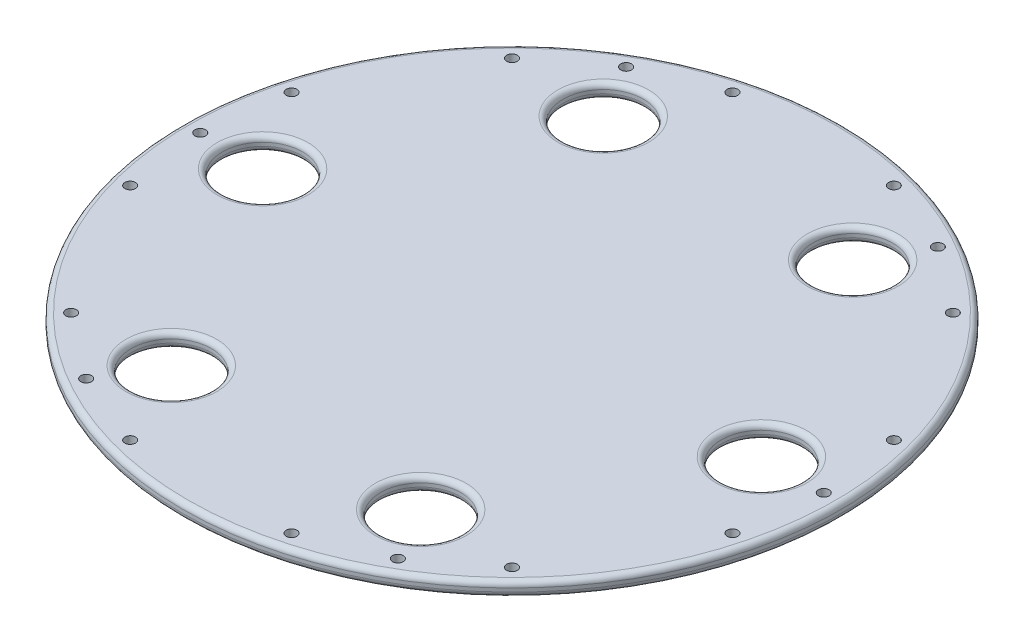
ISO-10303-21;
HEADER;
FILE_DESCRIPTION(('STEP AP214'),'2;1');
FILE_NAME('part.step','',(''),(''),'','','');
FILE_SCHEMA(('AUTOMOTIVE_DESIGN { 1 0 10303 214 1 1 1 1 }'));
ENDSEC;
DATA;
#1=APPLICATION_CONTEXT('core data for automotive mechanical design processes');
#2=APPLICATION_PROTOCOL_DEFINITION('international standard','automotive_design',2000,#1);
#3=PRODUCT_CONTEXT('',#1,'mechanical');
#4=PRODUCT('Part','Part','',(#3));
#5=PRODUCT_RELATED_PRODUCT_CATEGORY('part','',(#4));
#6=PRODUCT_DEFINITION_FORMATION('','',#4);
#7=PRODUCT_DEFINITION_CONTEXT('part definition',#1,'design');
#8=PRODUCT_DEFINITION('design','',#6,#7);
#9=PRODUCT_DEFINITION_SHAPE('','',#8);
#10=(LENGTH_UNIT() NAMED_UNIT(*) SI_UNIT(.MILLI.,.METRE.));
#11=(NAMED_UNIT(*) PLANE_ANGLE_UNIT() SI_UNIT($,.RADIAN.));
#12=(NAMED_UNIT(*) SI_UNIT($,.STERADIAN.) SOLID_ANGLE_UNIT());
#13=UNCERTAINTY_MEASURE_WITH_UNIT(LENGTH_MEASURE(1.E-05),#10,'distance_accuracy_value','');
#14=(GEOMETRIC_REPRESENTATION_CONTEXT(3) GLOBAL_UNCERTAINTY_ASSIGNED_CONTEXT((#13)) GLOBAL_UNIT_ASSIGNED_CONTEXT((#10,
#11,#12)) REPRESENTATION_CONTEXT('',''));
#15=CARTESIAN_POINT('',(0.,0.,0.));
#16=DIRECTION('',(0.,0.,1.));
#17=DIRECTION('',(1.,0.,0.));
#18=AXIS2_PLACEMENT_3D('',#15,#16,#17);
#19=CARTESIAN_POINT('',(0.,4.,0.));
#20=DIRECTION('',(0.,-1.,0.));
#21=DIRECTION('',(0.,0.,-1.));
#22=AXIS2_PLACEMENT_3D('',#19,#20,#21);
#23=CYLINDRICAL_SURFACE('',#22,92.5);
#24=CARTESIAN_POINT('',(0.,2.5,0.));
#25=DIRECTION('',(0.,1.,0.));
#26=DIRECTION('',(0.,0.,1.));
#27=AXIS2_PLACEMENT_3D('',#24,#25,#26);
#28=CIRCLE('',#27,92.5);
#29=CARTESIAN_POINT('',(0.,2.5,92.5));
#30=VERTEX_POINT('',#29);
#31=EDGE_CURVE('E10',#30,#30,#28,.F.);
#32=ORIENTED_EDGE('',*,*,#31,.T.);
#33=EDGE_LOOP('',(#32));
#34=FACE_BOUND('',#33,.T.);
#35=CARTESIAN_POINT('',(0.,1.5,0.));
#36=DIRECTION('',(0.,1.,0.));
#37=DIRECTION('',(0.,0.,1.));
#38=AXIS2_PLACEMENT_3D('',#35,#36,#37);
#39=CIRCLE('',#38,92.5);
#40=CARTESIAN_POINT('',(0.,1.5,92.5));
#41=VERTEX_POINT('',#40);
#42=EDGE_CURVE('E51',#41,#41,#39,.T.);
#43=ORIENTED_EDGE('',*,*,#42,.T.);
#44=EDGE_LOOP('',(#43));
#45=FACE_BOUND('',#44,.T.);
#46=ADVANCED_FACE('F43',(#34,#45),#23,.T.);
#47=CARTESIAN_POINT('',(0.,4.,0.));
#48=DIRECTION('',(0.,1.,0.));
#49=DIRECTION('',(0.,0.,1.));
#50=AXIS2_PLACEMENT_3D('',#47,#48,#49);
#51=PLANE('',#50);
#52=CARTESIAN_POINT('',(35.0000000000007,4.,-60.6217782649103));
#53=DIRECTION('',(0.,1.,0.));
#54=DIRECTION('',(0.,0.,1.));
#55=AXIS2_PLACEMENT_3D('',#52,#53,#54);
#56=CIRCLE('',#55,12.75);
#57=CARTESIAN_POINT('',(35.0000000000007,4.,-47.8717782649103));
#58=VERTEX_POINT('',#57);
#59=EDGE_CURVE('E127',#58,#58,#56,.F.);
#60=ORIENTED_EDGE('',*,*,#59,.T.);
#61=EDGE_LOOP('',(#60));
#62=FACE_BOUND('',#61,.T.);
#63=CARTESIAN_POINT('',(-35.0000000000003,4.,-60.6217782649105));
#64=DIRECTION('',(0.,1.,0.));
#65=DIRECTION('',(0.,0.,1.));
#66=AXIS2_PLACEMENT_3D('',#63,#64,#65);
#67=CIRCLE('',#66,12.75);
#68=CARTESIAN_POINT('',(-35.0000000000003,4.,-47.8717782649105));
#69=VERTEX_POINT('',#68);
#70=EDGE_CURVE('E131',#69,#69,#67,.F.);
#71=ORIENTED_EDGE('',*,*,#70,.T.);
#72=EDGE_LOOP('',(#71));
#73=FACE_BOUND('',#72,.T.);
#74=CARTESIAN_POINT('',(70.,4.,0.));
#75=DIRECTION('',(0.,1.,0.));
#76=DIRECTION('',(0.,0.,1.));
#77=AXIS2_PLACEMENT_3D('',#74,#75,#76);
#78=CIRCLE('',#77,12.75);
#79=CARTESIAN_POINT('',(70.,4.,12.75));
#80=VERTEX_POINT('',#79);
#81=EDGE_CURVE('E135',#80,#80,#78,.F.);
#82=ORIENTED_EDGE('',*,*,#81,.T.);
#83=EDGE_LOOP('',(#82));
#84=FACE_BOUND('',#83,.T.);
#85=CARTESIAN_POINT('',(34.9999999999999,4.,60.6217782649108));
#86=DIRECTION('',(0.,1.,0.));
#87=DIRECTION('',(0.,0.,1.));
#88=AXIS2_PLACEMENT_3D('',#85,#86,#87);
#89=CIRCLE('',#88,12.75);
#90=CARTESIAN_POINT('',(34.9999999999999,4.,73.3717782649108));
#91=VERTEX_POINT('',#90);
#92=EDGE_CURVE('E139',#91,#91,#89,.F.);
#93=ORIENTED_EDGE('',*,*,#92,.T.);
#94=EDGE_LOOP('',(#93));
#95=FACE_BOUND('',#94,.T.);
#96=CARTESIAN_POINT('',(-35.0000000000003,4.,60.6217782649106));
#97=DIRECTION('',(0.,1.,0.));
#98=DIRECTION('',(0.,0.,1.));
#99=AXIS2_PLACEMENT_3D('',#96,#97,#98);
#100=CIRCLE('',#99,12.75);
#101=CARTESIAN_POINT('',(-35.0000000000003,4.,73.3717782649106));
#102=VERTEX_POINT('',#101);
#103=EDGE_CURVE('E143',#102,#102,#100,.F.);
#104=ORIENTED_EDGE('',*,*,#103,.T.);
#105=EDGE_LOOP('',(#104));
#106=FACE_BOUND('',#105,.T.);
#107=CARTESIAN_POINT('',(-70.,4.,-4.47558656802016E-13));
#108=DIRECTION('',(0.,1.,0.));
#109=DIRECTION('',(0.,0.,1.));
#110=AXIS2_PLACEMENT_3D('',#107,#108,#109);
#111=CIRCLE('',#110,12.75);
#112=CARTESIAN_POINT('',(-70.,4.,12.7499999999996));
#113=VERTEX_POINT('',#112);
#114=EDGE_CURVE('E147',#113,#113,#111,.F.);
#115=ORIENTED_EDGE('',*,*,#114,.T.);
#116=EDGE_LOOP('',(#115));
#117=FACE_BOUND('',#116,.T.);
#118=CARTESIAN_POINT('',(0.,4.,0.));
#119=DIRECTION('',(0.,1.,0.));
#120=DIRECTION('',(0.,0.,1.));
#121=AXIS2_PLACEMENT_3D('',#118,#119,#120);
#122=CIRCLE('',#121,91.);
#123=CARTESIAN_POINT('',(0.,4.,91.));
#124=VERTEX_POINT('',#123);
#125=EDGE_CURVE('E151',#124,#124,#122,.T.);
#126=ORIENTED_EDGE('',*,*,#125,.T.);
#127=EDGE_LOOP('',(#126));
#128=FACE_BOUND('',#127,.T.);
#129=CARTESIAN_POINT('',(-43.7499999999932,4.,75.7772228311387));
#130=DIRECTION('',(0.,1.,0.));
#131=DIRECTION('',(0.,0.,1.));
#132=AXIS2_PLACEMENT_3D('',#129,#130,#131);
#133=CIRCLE('',#132,1.50000000000557);
#134=CARTESIAN_POINT('',(-43.7499999999932,4.,77.2772228311443));
#135=VERTEX_POINT('',#134);
#136=EDGE_CURVE('E216',#135,#135,#133,.T.);
#137=ORIENTED_EDGE('',*,*,#136,.F.);
#138=EDGE_LOOP('',(#137));
#139=FACE_BOUND('',#138,.T.);
#140=CARTESIAN_POINT('',(-22.6466664464653,4.,84.5185098002893));
#141=DIRECTION('',(0.,1.,0.));
#142=DIRECTION('',(0.,0.,1.));
#143=AXIS2_PLACEMENT_3D('',#140,#141,#142);
#144=CIRCLE('',#143,1.50000000000306);
#145=CARTESIAN_POINT('',(-22.6466664464653,4.,86.0185098002924));
#146=VERTEX_POINT('',#145);
#147=EDGE_CURVE('E225',#146,#146,#144,.T.);
#148=ORIENTED_EDGE('',*,*,#147,.F.);
#149=EDGE_LOOP('',(#148));
#150=FACE_BOUND('',#149,.T.);
#151=CARTESIAN_POINT('',(22.6466664464725,4.,84.5185098002885));
#152=DIRECTION('',(0.,1.,0.));
#153=DIRECTION('',(0.,0.,1.));
#154=AXIS2_PLACEMENT_3D('',#151,#152,#153);
#155=CIRCLE('',#154,1.50000000000234);
#156=CARTESIAN_POINT('',(22.6466664464725,4.,86.0185098002908));
#157=VERTEX_POINT('',#156);
#158=EDGE_CURVE('E233',#157,#157,#155,.T.);
#159=ORIENTED_EDGE('',*,*,#158,.F.);
#160=EDGE_LOOP('',(#159));
#161=FACE_BOUND('',#160,.T.);
#162=CARTESIAN_POINT('',(43.7500000000069,4.,75.7772228311346));
#163=DIRECTION('',(0.,1.,0.));
#164=DIRECTION('',(0.,0.,1.));
#165=AXIS2_PLACEMENT_3D('',#162,#163,#164);
#166=CIRCLE('',#165,1.50000000000785);
#167=CARTESIAN_POINT('',(43.7500000000069,4.,77.2772228311424));
#168=VERTEX_POINT('',#167);
#169=EDGE_CURVE('E241',#168,#168,#166,.T.);
#170=ORIENTED_EDGE('',*,*,#169,.F.);
#171=EDGE_LOOP('',(#170));
#172=FACE_BOUND('',#171,.T.);
#173=CARTESIAN_POINT('',(61.8718433538251,4.,61.8718433538181));
#174=DIRECTION('',(0.,1.,0.));
#175=DIRECTION('',(0.,0.,1.));
#176=AXIS2_PLACEMENT_3D('',#173,#174,#175);
#177=CIRCLE('',#176,1.50000000000453);
#178=CARTESIAN_POINT('',(61.8718433538251,4.,63.3718433538227));
#179=VERTEX_POINT('',#178);
#180=EDGE_CURVE('E249',#179,#179,#177,.T.);
#181=ORIENTED_EDGE('',*,*,#180,.F.);
#182=EDGE_LOOP('',(#181));
#183=FACE_BOUND('',#182,.T.);
#184=CARTESIAN_POINT('',(61.871843353824,4.,-61.871843353822));
#185=DIRECTION('',(0.,1.,0.));
#186=DIRECTION('',(0.,0.,1.));
#187=AXIS2_PLACEMENT_3D('',#184,#185,#186);
#188=CIRCLE('',#187,1.50000000000005);
#189=CARTESIAN_POINT('',(61.871843353824,4.,-60.371843353822));
#190=VERTEX_POINT('',#189);
#191=EDGE_CURVE('E257',#190,#190,#188,.T.);
#192=ORIENTED_EDGE('',*,*,#191,.F.);
#193=EDGE_LOOP('',(#192));
#194=FACE_BOUND('',#193,.T.);
#195=CARTESIAN_POINT('',(43.7499999999997,4.,-75.7772228311423));
#196=DIRECTION('',(0.,1.,0.));
#197=DIRECTION('',(0.,0.,1.));
#198=AXIS2_PLACEMENT_3D('',#195,#196,#197);
#199=CIRCLE('',#198,1.50000000000427);
#200=CARTESIAN_POINT('',(43.7499999999997,4.,-74.2772228311381));
#201=VERTEX_POINT('',#200);
#202=EDGE_CURVE('E265',#201,#201,#199,.T.);
#203=ORIENTED_EDGE('',*,*,#202,.F.);
#204=EDGE_LOOP('',(#203));
#205=FACE_BOUND('',#204,.T.);
#206=CARTESIAN_POINT('',(22.6466664464717,4.,-84.5185098002929));
#207=DIRECTION('',(0.,1.,0.));
#208=DIRECTION('',(0.,0.,1.));
#209=AXIS2_PLACEMENT_3D('',#206,#207,#208);
#210=CIRCLE('',#209,1.49999999999999);
#211=CARTESIAN_POINT('',(22.6466664464717,4.,-83.018509800293));
#212=VERTEX_POINT('',#211);
#213=EDGE_CURVE('E208',#212,#212,#210,.T.);
#214=ORIENTED_EDGE('',*,*,#213,.F.);
#215=EDGE_LOOP('',(#214));
#216=FACE_BOUND('',#215,.T.);
#217=CARTESIAN_POINT('',(87.5000000000033,4.,-5.9871259849574E-12));
#218=DIRECTION('',(0.,1.,0.));
#219=DIRECTION('',(0.,0.,1.));
#220=AXIS2_PLACEMENT_3D('',#217,#218,#219);
#221=CIRCLE('',#220,1.50000000000731);
#222=CARTESIAN_POINT('',(87.5000000000033,4.,1.50000000000132));
#223=VERTEX_POINT('',#222);
#224=EDGE_CURVE('E168',#223,#223,#221,.T.);
#225=ORIENTED_EDGE('',*,*,#224,.F.);
#226=EDGE_LOOP('',(#225));
#227=FACE_BOUND('',#226,.T.);
#228=CARTESIAN_POINT('',(84.5185098002933,4.,22.6466664464682));
#229=DIRECTION('',(0.,1.,0.));
#230=DIRECTION('',(0.,0.,1.));
#231=AXIS2_PLACEMENT_3D('',#228,#229,#230);
#232=CIRCLE('',#231,1.50000000000274);
#233=CARTESIAN_POINT('',(84.5185098002933,4.,24.146666446471));
#234=VERTEX_POINT('',#233);
#235=EDGE_CURVE('E193',#234,#234,#232,.T.);
#236=ORIENTED_EDGE('',*,*,#235,.F.);
#237=EDGE_LOOP('',(#236));
#238=FACE_BOUND('',#237,.T.);
#239=CARTESIAN_POINT('',(-61.8718433538187,4.,-61.8718433538218));
#240=DIRECTION('',(0.,1.,0.));
#241=DIRECTION('',(0.,0.,1.));
#242=AXIS2_PLACEMENT_3D('',#239,#240,#241);
#243=CIRCLE('',#242,1.49999999999655);
#244=CARTESIAN_POINT('',(-61.8718433538187,4.,-60.3718433538252));
#245=VERTEX_POINT('',#244);
#246=EDGE_CURVE('E185',#245,#245,#243,.T.);
#247=ORIENTED_EDGE('',*,*,#246,.F.);
#248=EDGE_LOOP('',(#247));
#249=FACE_BOUND('',#248,.T.);
#250=CARTESIAN_POINT('',(-43.7500000000004,4.,-75.7772228311382));
#251=DIRECTION('',(0.,1.,0.));
#252=DIRECTION('',(0.,0.,1.));
#253=AXIS2_PLACEMENT_3D('',#250,#251,#252);
#254=CIRCLE('',#253,1.50000000000004);
#255=CARTESIAN_POINT('',(-43.7500000000004,4.,-74.2772228311382));
#256=VERTEX_POINT('',#255);
#257=EDGE_CURVE('E176',#256,#256,#254,.T.);
#258=ORIENTED_EDGE('',*,*,#257,.F.);
#259=EDGE_LOOP('',(#258));
#260=FACE_BOUND('',#259,.T.);
#261=CARTESIAN_POINT('',(-22.6466664464661,4.,-84.5185098002921));
#262=DIRECTION('',(0.,1.,0.));
#263=DIRECTION('',(0.,0.,1.));
#264=AXIS2_PLACEMENT_3D('',#261,#262,#263);
#265=CIRCLE('',#264,1.49999999999518);
#266=CARTESIAN_POINT('',(-22.6466664464661,4.,-83.0185098002969));
#267=VERTEX_POINT('',#266);
#268=EDGE_CURVE('E177',#267,#267,#265,.T.);
#269=ORIENTED_EDGE('',*,*,#268,.F.);
#270=EDGE_LOOP('',(#269));
#271=FACE_BOUND('',#270,.T.);
#272=CARTESIAN_POINT('',(-84.5185098002868,4.,-22.6466664464719));
#273=DIRECTION('',(0.,1.,0.));
#274=DIRECTION('',(0.,0.,1.));
#275=AXIS2_PLACEMENT_3D('',#272,#273,#274);
#276=CIRCLE('',#275,1.49999999999633);
#277=CARTESIAN_POINT('',(-84.5185098002868,4.,-21.1466664464756));
#278=VERTEX_POINT('',#277);
#279=EDGE_CURVE('E280',#278,#278,#276,.T.);
#280=ORIENTED_EDGE('',*,*,#279,.F.);
#281=EDGE_LOOP('',(#280));
#282=FACE_BOUND('',#281,.T.);
#283=CARTESIAN_POINT('',(-87.4999999999969,4.,2.3177192614952E-12));
#284=DIRECTION('',(0.,1.,0.));
#285=DIRECTION('',(0.,0.,1.));
#286=AXIS2_PLACEMENT_3D('',#283,#284,#285);
#287=CIRCLE('',#286,1.50000000000212);
#288=CARTESIAN_POINT('',(-87.4999999999969,4.,1.50000000000444));
#289=VERTEX_POINT('',#288);
#290=EDGE_CURVE('E288',#289,#289,#287,.T.);
#291=ORIENTED_EDGE('',*,*,#290,.F.);
#292=EDGE_LOOP('',(#291));
#293=FACE_BOUND('',#292,.T.);
#294=CARTESIAN_POINT('',(-84.5185098002872,4.,22.6466664464693));
#295=DIRECTION('',(0.,1.,0.));
#296=DIRECTION('',(0.,0.,1.));
#297=AXIS2_PLACEMENT_3D('',#294,#295,#296);
#298=CIRCLE('',#297,1.49999999999951);
#299=CARTESIAN_POINT('',(-84.5185098002872,4.,24.1466664464689));
#300=VERTEX_POINT('',#299);
#301=EDGE_CURVE('E296',#300,#300,#298,.T.);
#302=ORIENTED_EDGE('',*,*,#301,.F.);
#303=EDGE_LOOP('',(#302));
#304=FACE_BOUND('',#303,.T.);
#305=CARTESIAN_POINT('',(-61.8718433538175,4.,61.8718433538184));
#306=DIRECTION('',(0.,1.,0.));
#307=DIRECTION('',(0.,0.,1.));
#308=AXIS2_PLACEMENT_3D('',#305,#306,#307);
#309=CIRCLE('',#308,1.49999999999945);
#310=CARTESIAN_POINT('',(-61.8718433538175,4.,63.3718433538179));
#311=VERTEX_POINT('',#310);
#312=EDGE_CURVE('E217',#311,#311,#309,.T.);
#313=ORIENTED_EDGE('',*,*,#312,.F.);
#314=EDGE_LOOP('',(#313));
#315=FACE_BOUND('',#314,.T.);
#316=CARTESIAN_POINT('',(84.5185098002936,4.,-22.646666446473));
#317=DIRECTION('',(0.,1.,0.));
#318=DIRECTION('',(0.,0.,1.));
#319=AXIS2_PLACEMENT_3D('',#316,#317,#318);
#320=CIRCLE('',#319,1.50000000000312);
#321=CARTESIAN_POINT('',(84.5185098002936,4.,-21.1466664464699));
#322=VERTEX_POINT('',#321);
#323=EDGE_CURVE('E164',#322,#322,#320,.T.);
#324=ORIENTED_EDGE('',*,*,#323,.F.);
#325=EDGE_LOOP('',(#324));
#326=FACE_BOUND('',#325,.T.);
#327=ADVANCED_FACE('F310',(#62,#73,#84,#95,#106,#117,#128,#139,#150,#161,#172,#183,#194,#205,
#216,#227,#238,#249,#260,#271,#282,#293,#304,#315,#326),#51,.T.);
#328=CARTESIAN_POINT('',(0.,0.,0.));
#329=DIRECTION('',(0.,1.,0.));
#330=DIRECTION('',(0.,0.,1.));
#331=AXIS2_PLACEMENT_3D('',#328,#329,#330);
#332=PLANE('',#331);
#333=CARTESIAN_POINT('',(35.0000000000007,0.,-60.6217782649103));
#334=DIRECTION('',(0.,1.,0.));
#335=DIRECTION('',(0.,0.,1.));
#336=AXIS2_PLACEMENT_3D('',#333,#334,#335);
#337=CIRCLE('',#336,12.75);
#338=CARTESIAN_POINT('',(35.0000000000007,0.,-47.8717782649103));
#339=VERTEX_POINT('',#338);
#340=EDGE_CURVE('E99',#339,#339,#337,.T.);
#341=ORIENTED_EDGE('',*,*,#340,.T.);
#342=EDGE_LOOP('',(#341));
#343=FACE_BOUND('',#342,.T.);
#344=CARTESIAN_POINT('',(-35.0000000000003,0.,-60.6217782649105));
#345=DIRECTION('',(0.,1.,0.));
#346=DIRECTION('',(0.,0.,1.));
#347=AXIS2_PLACEMENT_3D('',#344,#345,#346);
#348=CIRCLE('',#347,12.75);
#349=CARTESIAN_POINT('',(-35.0000000000003,0.,-47.8717782649105));
#350=VERTEX_POINT('',#349);
#351=EDGE_CURVE('E103',#350,#350,#348,.T.);
#352=ORIENTED_EDGE('',*,*,#351,.T.);
#353=EDGE_LOOP('',(#352));
#354=FACE_BOUND('',#353,.T.);
#355=CARTESIAN_POINT('',(70.,0.,0.));
#356=DIRECTION('',(0.,1.,0.));
#357=DIRECTION('',(0.,0.,1.));
#358=AXIS2_PLACEMENT_3D('',#355,#356,#357);
#359=CIRCLE('',#358,12.75);
#360=CARTESIAN_POINT('',(70.,0.,12.75));
#361=VERTEX_POINT('',#360);
#362=EDGE_CURVE('E107',#361,#361,#359,.T.);
#363=ORIENTED_EDGE('',*,*,#362,.T.);
#364=EDGE_LOOP('',(#363));
#365=FACE_BOUND('',#364,.T.);
#366=CARTESIAN_POINT('',(34.9999999999999,0.,60.6217782649108));
#367=DIRECTION('',(0.,1.,0.));
#368=DIRECTION('',(0.,0.,1.));
#369=AXIS2_PLACEMENT_3D('',#366,#367,#368);
#370=CIRCLE('',#369,12.75);
#371=CARTESIAN_POINT('',(34.9999999999999,0.,73.3717782649108));
#372=VERTEX_POINT('',#371);
#373=EDGE_CURVE('E111',#372,#372,#370,.T.);
#374=ORIENTED_EDGE('',*,*,#373,.T.);
#375=EDGE_LOOP('',(#374));
#376=FACE_BOUND('',#375,.T.);
#377=CARTESIAN_POINT('',(-35.0000000000003,0.,60.6217782649106));
#378=DIRECTION('',(0.,1.,0.));
#379=DIRECTION('',(0.,0.,1.));
#380=AXIS2_PLACEMENT_3D('',#377,#378,#379);
#381=CIRCLE('',#380,12.75);
#382=CARTESIAN_POINT('',(-35.0000000000003,0.,73.3717782649106));
#383=VERTEX_POINT('',#382);
#384=EDGE_CURVE('E115',#383,#383,#381,.T.);
#385=ORIENTED_EDGE('',*,*,#384,.T.);
#386=EDGE_LOOP('',(#385));
#387=FACE_BOUND('',#386,.T.);
#388=CARTESIAN_POINT('',(-70.,0.,-4.47558656802016E-13));
#389=DIRECTION('',(0.,1.,0.));
#390=DIRECTION('',(0.,0.,1.));
#391=AXIS2_PLACEMENT_3D('',#388,#389,#390);
#392=CIRCLE('',#391,12.75);
#393=CARTESIAN_POINT('',(-70.,0.,12.7499999999996));
#394=VERTEX_POINT('',#393);
#395=EDGE_CURVE('E119',#394,#394,#392,.T.);
#396=ORIENTED_EDGE('',*,*,#395,.T.);
#397=EDGE_LOOP('',(#396));
#398=FACE_BOUND('',#397,.T.);
#399=CARTESIAN_POINT('',(0.,0.,0.));
#400=DIRECTION('',(0.,1.,0.));
#401=DIRECTION('',(0.,0.,1.));
#402=AXIS2_PLACEMENT_3D('',#399,#400,#401);
#403=CIRCLE('',#402,91.);
#404=CARTESIAN_POINT('',(0.,0.,91.));
#405=VERTEX_POINT('',#404);
#406=EDGE_CURVE('E123',#405,#405,#403,.F.);
#407=ORIENTED_EDGE('',*,*,#406,.T.);
#408=EDGE_LOOP('',(#407));
#409=FACE_BOUND('',#408,.T.);
#410=CARTESIAN_POINT('',(-43.7499999999932,0.,75.7772228311387));
#411=DIRECTION('',(0.,1.,0.));
#412=DIRECTION('',(0.,0.,1.));
#413=AXIS2_PLACEMENT_3D('',#410,#411,#412);
#414=CIRCLE('',#413,1.50000000000557);
#415=CARTESIAN_POINT('',(-43.7499999999932,0.,77.2772228311443));
#416=VERTEX_POINT('',#415);
#417=EDGE_CURVE('E212',#416,#416,#414,.T.);
#418=ORIENTED_EDGE('',*,*,#417,.T.);
#419=EDGE_LOOP('',(#418));
#420=FACE_BOUND('',#419,.T.);
#421=CARTESIAN_POINT('',(-22.6466664464653,0.,84.5185098002893));
#422=DIRECTION('',(0.,1.,0.));
#423=DIRECTION('',(0.,0.,1.));
#424=AXIS2_PLACEMENT_3D('',#421,#422,#423);
#425=CIRCLE('',#424,1.50000000000306);
#426=CARTESIAN_POINT('',(-22.6466664464653,0.,86.0185098002924));
#427=VERTEX_POINT('',#426);
#428=EDGE_CURVE('E221',#427,#427,#425,.T.);
#429=ORIENTED_EDGE('',*,*,#428,.T.);
#430=EDGE_LOOP('',(#429));
#431=FACE_BOUND('',#430,.T.);
#432=CARTESIAN_POINT('',(22.6466664464725,0.,84.5185098002885));
#433=DIRECTION('',(0.,1.,0.));
#434=DIRECTION('',(0.,0.,1.));
#435=AXIS2_PLACEMENT_3D('',#432,#433,#434);
#436=CIRCLE('',#435,1.50000000000234);
#437=CARTESIAN_POINT('',(22.6466664464725,0.,86.0185098002908));
#438=VERTEX_POINT('',#437);
#439=EDGE_CURVE('E229',#438,#438,#436,.T.);
#440=ORIENTED_EDGE('',*,*,#439,.T.);
#441=EDGE_LOOP('',(#440));
#442=FACE_BOUND('',#441,.T.);
#443=CARTESIAN_POINT('',(43.7500000000069,0.,75.7772228311346));
#444=DIRECTION('',(0.,1.,0.));
#445=DIRECTION('',(0.,0.,1.));
#446=AXIS2_PLACEMENT_3D('',#443,#444,#445);
#447=CIRCLE('',#446,1.50000000000785);
#448=CARTESIAN_POINT('',(43.7500000000069,0.,77.2772228311424));
#449=VERTEX_POINT('',#448);
#450=EDGE_CURVE('E237',#449,#449,#447,.T.);
#451=ORIENTED_EDGE('',*,*,#450,.T.);
#452=EDGE_LOOP('',(#451));
#453=FACE_BOUND('',#452,.T.);
#454=CARTESIAN_POINT('',(61.8718433538251,0.,61.8718433538181));
#455=DIRECTION('',(0.,1.,0.));
#456=DIRECTION('',(0.,0.,1.));
#457=AXIS2_PLACEMENT_3D('',#454,#455,#456);
#458=CIRCLE('',#457,1.50000000000453);
#459=CARTESIAN_POINT('',(61.8718433538251,0.,63.3718433538227));
#460=VERTEX_POINT('',#459);
#461=EDGE_CURVE('E245',#460,#460,#458,.T.);
#462=ORIENTED_EDGE('',*,*,#461,.T.);
#463=EDGE_LOOP('',(#462));
#464=FACE_BOUND('',#463,.T.);
#465=CARTESIAN_POINT('',(61.871843353824,0.,-61.871843353822));
#466=DIRECTION('',(0.,1.,0.));
#467=DIRECTION('',(0.,0.,1.));
#468=AXIS2_PLACEMENT_3D('',#465,#466,#467);
#469=CIRCLE('',#468,1.50000000000005);
#470=CARTESIAN_POINT('',(61.871843353824,0.,-60.371843353822));
#471=VERTEX_POINT('',#470);
#472=EDGE_CURVE('E253',#471,#471,#469,.T.);
#473=ORIENTED_EDGE('',*,*,#472,.T.);
#474=EDGE_LOOP('',(#473));
#475=FACE_BOUND('',#474,.T.);
#476=CARTESIAN_POINT('',(43.7499999999997,0.,-75.7772228311423));
#477=DIRECTION('',(0.,1.,0.));
#478=DIRECTION('',(0.,0.,1.));
#479=AXIS2_PLACEMENT_3D('',#476,#477,#478);
#480=CIRCLE('',#479,1.50000000000427);
#481=CARTESIAN_POINT('',(43.7499999999997,0.,-74.2772228311381));
#482=VERTEX_POINT('',#481);
#483=EDGE_CURVE('E261',#482,#482,#480,.T.);
#484=ORIENTED_EDGE('',*,*,#483,.T.);
#485=EDGE_LOOP('',(#484));
#486=FACE_BOUND('',#485,.T.);
#487=CARTESIAN_POINT('',(22.6466664464717,0.,-84.5185098002929));
#488=DIRECTION('',(0.,1.,0.));
#489=DIRECTION('',(0.,0.,1.));
#490=AXIS2_PLACEMENT_3D('',#487,#488,#489);
#491=CIRCLE('',#490,1.49999999999999);
#492=CARTESIAN_POINT('',(22.6466664464717,0.,-83.018509800293));
#493=VERTEX_POINT('',#492);
#494=EDGE_CURVE('E269',#493,#493,#491,.T.);
#495=ORIENTED_EDGE('',*,*,#494,.T.);
#496=EDGE_LOOP('',(#495));
#497=FACE_BOUND('',#496,.T.);
#498=CARTESIAN_POINT('',(87.5000000000033,0.,-5.9871259849574E-12));
#499=DIRECTION('',(0.,1.,0.));
#500=DIRECTION('',(0.,0.,1.));
#501=AXIS2_PLACEMENT_3D('',#498,#499,#500);
#502=CIRCLE('',#501,1.50000000000731);
#503=CARTESIAN_POINT('',(87.5000000000033,0.,1.50000000000132));
#504=VERTEX_POINT('',#503);
#505=EDGE_CURVE('E197',#504,#504,#502,.T.);
#506=ORIENTED_EDGE('',*,*,#505,.T.);
#507=EDGE_LOOP('',(#506));
#508=FACE_BOUND('',#507,.T.);
#509=CARTESIAN_POINT('',(84.5185098002933,0.,22.6466664464682));
#510=DIRECTION('',(0.,1.,0.));
#511=DIRECTION('',(0.,0.,1.));
#512=AXIS2_PLACEMENT_3D('',#509,#510,#511);
#513=CIRCLE('',#512,1.50000000000274);
#514=CARTESIAN_POINT('',(84.5185098002933,0.,24.146666446471));
#515=VERTEX_POINT('',#514);
#516=EDGE_CURVE('E189',#515,#515,#513,.T.);
#517=ORIENTED_EDGE('',*,*,#516,.T.);
#518=EDGE_LOOP('',(#517));
#519=FACE_BOUND('',#518,.T.);
#520=CARTESIAN_POINT('',(-61.8718433538187,0.,-61.8718433538218));
#521=DIRECTION('',(0.,1.,0.));
#522=DIRECTION('',(0.,0.,1.));
#523=AXIS2_PLACEMENT_3D('',#520,#521,#522);
#524=CIRCLE('',#523,1.49999999999655);
#525=CARTESIAN_POINT('',(-61.8718433538187,0.,-60.3718433538252));
#526=VERTEX_POINT('',#525);
#527=EDGE_CURVE('E181',#526,#526,#524,.T.);
#528=ORIENTED_EDGE('',*,*,#527,.T.);
#529=EDGE_LOOP('',(#528));
#530=FACE_BOUND('',#529,.T.);
#531=CARTESIAN_POINT('',(-43.7500000000004,0.,-75.7772228311382));
#532=DIRECTION('',(0.,1.,0.));
#533=DIRECTION('',(0.,0.,1.));
#534=AXIS2_PLACEMENT_3D('',#531,#532,#533);
#535=CIRCLE('',#534,1.50000000000004);
#536=CARTESIAN_POINT('',(-43.7500000000004,0.,-74.2772228311382));
#537=VERTEX_POINT('',#536);
#538=EDGE_CURVE('E172',#537,#537,#535,.T.);
#539=ORIENTED_EDGE('',*,*,#538,.T.);
#540=EDGE_LOOP('',(#539));
#541=FACE_BOUND('',#540,.T.);
#542=CARTESIAN_POINT('',(-22.6466664464661,0.,-84.5185098002921));
#543=DIRECTION('',(0.,1.,0.));
#544=DIRECTION('',(0.,0.,1.));
#545=AXIS2_PLACEMENT_3D('',#542,#543,#544);
#546=CIRCLE('',#545,1.49999999999518);
#547=CARTESIAN_POINT('',(-22.6466664464661,0.,-83.0185098002969));
#548=VERTEX_POINT('',#547);
#549=EDGE_CURVE('E204',#548,#548,#546,.T.);
#550=ORIENTED_EDGE('',*,*,#549,.T.);
#551=EDGE_LOOP('',(#550));
#552=FACE_BOUND('',#551,.T.);
#553=CARTESIAN_POINT('',(-84.5185098002868,0.,-22.6466664464719));
#554=DIRECTION('',(0.,1.,0.));
#555=DIRECTION('',(0.,0.,1.));
#556=AXIS2_PLACEMENT_3D('',#553,#554,#555);
#557=CIRCLE('',#556,1.49999999999633);
#558=CARTESIAN_POINT('',(-84.5185098002868,0.,-21.1466664464756));
#559=VERTEX_POINT('',#558);
#560=EDGE_CURVE('E276',#559,#559,#557,.T.);
#561=ORIENTED_EDGE('',*,*,#560,.T.);
#562=EDGE_LOOP('',(#561));
#563=FACE_BOUND('',#562,.T.);
#564=CARTESIAN_POINT('',(-87.4999999999969,0.,2.3177192614952E-12));
#565=DIRECTION('',(0.,1.,0.));
#566=DIRECTION('',(0.,0.,1.));
#567=AXIS2_PLACEMENT_3D('',#564,#565,#566);
#568=CIRCLE('',#567,1.50000000000212);
#569=CARTESIAN_POINT('',(-87.4999999999969,0.,1.50000000000444));
#570=VERTEX_POINT('',#569);
#571=EDGE_CURVE('E284',#570,#570,#568,.T.);
#572=ORIENTED_EDGE('',*,*,#571,.T.);
#573=EDGE_LOOP('',(#572));
#574=FACE_BOUND('',#573,.T.);
#575=CARTESIAN_POINT('',(-84.5185098002872,0.,22.6466664464693));
#576=DIRECTION('',(0.,1.,0.));
#577=DIRECTION('',(0.,0.,1.));
#578=AXIS2_PLACEMENT_3D('',#575,#576,#577);
#579=CIRCLE('',#578,1.49999999999951);
#580=CARTESIAN_POINT('',(-84.5185098002872,0.,24.1466664464689));
#581=VERTEX_POINT('',#580);
#582=EDGE_CURVE('E292',#581,#581,#579,.T.);
#583=ORIENTED_EDGE('',*,*,#582,.T.);
#584=EDGE_LOOP('',(#583));
#585=FACE_BOUND('',#584,.T.);
#586=CARTESIAN_POINT('',(-61.8718433538175,0.,61.8718433538184));
#587=DIRECTION('',(0.,1.,0.));
#588=DIRECTION('',(0.,0.,1.));
#589=AXIS2_PLACEMENT_3D('',#586,#587,#588);
#590=CIRCLE('',#589,1.49999999999945);
#591=CARTESIAN_POINT('',(-61.8718433538175,0.,63.3718433538179));
#592=VERTEX_POINT('',#591);
#593=EDGE_CURVE('E300',#592,#592,#590,.T.);
#594=ORIENTED_EDGE('',*,*,#593,.T.);
#595=EDGE_LOOP('',(#594));
#596=FACE_BOUND('',#595,.T.);
#597=CARTESIAN_POINT('',(84.5185098002936,0.,-22.646666446473));
#598=DIRECTION('',(0.,1.,0.));
#599=DIRECTION('',(0.,0.,1.));
#600=AXIS2_PLACEMENT_3D('',#597,#598,#599);
#601=CIRCLE('',#600,1.50000000000312);
#602=CARTESIAN_POINT('',(84.5185098002936,0.,-21.1466664464699));
#603=VERTEX_POINT('',#602);
#604=EDGE_CURVE('E163',#603,#603,#601,.T.);
#605=ORIENTED_EDGE('',*,*,#604,.T.);
#606=EDGE_LOOP('',(#605));
#607=FACE_BOUND('',#606,.T.);
#608=ADVANCED_FACE('F313',(#343,#354,#365,#376,#387,#398,#409,#420,#431,#442,#453,#464,#475,
#486,#497,#508,#519,#530,#541,#552,#563,#574,#585,#596,#607),#332,.F.);
#609=CARTESIAN_POINT('',(84.5185098002936,0.,-22.646666446473));
#610=DIRECTION('',(0.,1.,0.));
#611=DIRECTION('',(0.,0.,1.));
#612=AXIS2_PLACEMENT_3D('',#609,#610,#611);
#613=CYLINDRICAL_SURFACE('',#612,1.50000000000312);
#614=ORIENTED_EDGE('',*,*,#604,.F.);
#615=EDGE_LOOP('',(#614));
#616=FACE_BOUND('',#615,.T.);
#617=ORIENTED_EDGE('',*,*,#323,.T.);
#618=EDGE_LOOP('',(#617));
#619=FACE_BOUND('',#618,.T.);
#620=ADVANCED_FACE('F318',(#616,#619),#613,.F.);
#621=CARTESIAN_POINT('',(-61.8718433538175,0.,61.8718433538184));
#622=DIRECTION('',(0.,1.,0.));
#623=DIRECTION('',(0.,0.,1.));
#624=AXIS2_PLACEMENT_3D('',#621,#622,#623);
#625=CYLINDRICAL_SURFACE('',#624,1.49999999999945);
#626=ORIENTED_EDGE('',*,*,#593,.F.);
#627=EDGE_LOOP('',(#626));
#628=FACE_BOUND('',#627,.T.);
#629=ORIENTED_EDGE('',*,*,#312,.T.);
#630=EDGE_LOOP('',(#629));
#631=FACE_BOUND('',#630,.T.);
#632=ADVANCED_FACE('F308',(#628,#631),#625,.F.);
#633=CARTESIAN_POINT('',(-84.5185098002872,0.,22.6466664464693));
#634=DIRECTION('',(0.,1.,0.));
#635=DIRECTION('',(0.,0.,1.));
#636=AXIS2_PLACEMENT_3D('',#633,#634,#635);
#637=CYLINDRICAL_SURFACE('',#636,1.49999999999951);
#638=ORIENTED_EDGE('',*,*,#582,.F.);
#639=EDGE_LOOP('',(#638));
#640=FACE_BOUND('',#639,.T.);
#641=ORIENTED_EDGE('',*,*,#301,.T.);
#642=EDGE_LOOP('',(#641));
#643=FACE_BOUND('',#642,.T.);
#644=ADVANCED_FACE('F325',(#640,#643),#637,.F.);
#645=CARTESIAN_POINT('',(-87.4999999999969,0.,2.3177192614952E-12));
#646=DIRECTION('',(0.,1.,0.));
#647=DIRECTION('',(0.,0.,1.));
#648=AXIS2_PLACEMENT_3D('',#645,#646,#647);
#649=CYLINDRICAL_SURFACE('',#648,1.50000000000212);
#650=ORIENTED_EDGE('',*,*,#571,.F.);
#651=EDGE_LOOP('',(#650));
#652=FACE_BOUND('',#651,.T.);
#653=ORIENTED_EDGE('',*,*,#290,.T.);
#654=EDGE_LOOP('',(#653));
#655=FACE_BOUND('',#654,.T.);
#656=ADVANCED_FACE('F431',(#652,#655),#649,.F.);
#657=CARTESIAN_POINT('',(-84.5185098002868,0.,-22.6466664464719));
#658=DIRECTION('',(0.,1.,0.));
#659=DIRECTION('',(0.,0.,1.));
#660=AXIS2_PLACEMENT_3D('',#657,#658,#659);
#661=CYLINDRICAL_SURFACE('',#660,1.49999999999633);
#662=ORIENTED_EDGE('',*,*,#560,.F.);
#663=EDGE_LOOP('',(#662));
#664=FACE_BOUND('',#663,.T.);
#665=ORIENTED_EDGE('',*,*,#279,.T.);
#666=EDGE_LOOP('',(#665));
#667=FACE_BOUND('',#666,.T.);
#668=ADVANCED_FACE('F437',(#664,#667),#661,.F.);
#669=CARTESIAN_POINT('',(-70.,0.,-4.47558656802016E-13));
#670=DIRECTION('',(0.,1.,0.));
#671=DIRECTION('',(0.,0.,1.));
#672=AXIS2_PLACEMENT_3D('',#669,#670,#671);
#673=CYLINDRICAL_SURFACE('',#672,11.25);
#674=CARTESIAN_POINT('',(-70.,2.5,-4.47558656802016E-13));
#675=DIRECTION('',(0.,1.,0.));
#676=DIRECTION('',(0.,0.,1.));
#677=AXIS2_PLACEMENT_3D('',#674,#675,#676);
#678=CIRCLE('',#677,11.25);
#679=CARTESIAN_POINT('',(-70.,2.5,11.2499999999996));
#680=VERTEX_POINT('',#679);
#681=EDGE_CURVE('E56',#680,#680,#678,.T.);
#682=ORIENTED_EDGE('',*,*,#681,.T.);
#683=EDGE_LOOP('',(#682));
#684=FACE_BOUND('',#683,.T.);
#685=CARTESIAN_POINT('',(-70.,1.5,-4.47558656802016E-13));
#686=DIRECTION('',(0.,1.,0.));
#687=DIRECTION('',(0.,0.,1.));
#688=AXIS2_PLACEMENT_3D('',#685,#686,#687);
#689=CIRCLE('',#688,11.25);
#690=CARTESIAN_POINT('',(-70.,1.5,11.2499999999996));
#691=VERTEX_POINT('',#690);
#692=EDGE_CURVE('E61',#691,#691,#689,.F.);
#693=ORIENTED_EDGE('',*,*,#692,.T.);
#694=EDGE_LOOP('',(#693));
#695=FACE_BOUND('',#694,.T.);
#696=ADVANCED_FACE('F445',(#684,#695),#673,.F.);
#697=CARTESIAN_POINT('',(-35.0000000000003,0.,60.6217782649106));
#698=DIRECTION('',(0.,1.,0.));
#699=DIRECTION('',(0.,0.,1.));
#700=AXIS2_PLACEMENT_3D('',#697,#698,#699);
#701=CYLINDRICAL_SURFACE('',#700,11.25);
#702=CARTESIAN_POINT('',(-35.0000000000003,2.5,60.6217782649106));
#703=DIRECTION('',(0.,1.,0.));
#704=DIRECTION('',(0.,0.,1.));
#705=AXIS2_PLACEMENT_3D('',#702,#703,#704);
#706=CIRCLE('',#705,11.25);
#707=CARTESIAN_POINT('',(-35.0000000000003,2.5,71.8717782649106));
#708=VERTEX_POINT('',#707);
#709=EDGE_CURVE('E67',#708,#708,#706,.T.);
#710=ORIENTED_EDGE('',*,*,#709,.T.);
#711=EDGE_LOOP('',(#710));
#712=FACE_BOUND('',#711,.T.);
#713=CARTESIAN_POINT('',(-35.0000000000003,1.5,60.6217782649106));
#714=DIRECTION('',(0.,1.,0.));
#715=DIRECTION('',(0.,0.,1.));
#716=AXIS2_PLACEMENT_3D('',#713,#714,#715);
#717=CIRCLE('',#716,11.25);
#718=CARTESIAN_POINT('',(-35.0000000000003,1.5,71.8717782649106));
#719=VERTEX_POINT('',#718);
#720=EDGE_CURVE('E71',#719,#719,#717,.F.);
#721=ORIENTED_EDGE('',*,*,#720,.T.);
#722=EDGE_LOOP('',(#721));
#723=FACE_BOUND('',#722,.T.);
#724=ADVANCED_FACE('F688',(#712,#723),#701,.F.);
#725=CARTESIAN_POINT('',(34.9999999999999,0.,60.6217782649108));
#726=DIRECTION('',(0.,1.,0.));
#727=DIRECTION('',(0.,0.,1.));
#728=AXIS2_PLACEMENT_3D('',#725,#726,#727);
#729=CYLINDRICAL_SURFACE('',#728,11.25);
#730=CARTESIAN_POINT('',(34.9999999999999,2.5,60.6217782649108));
#731=DIRECTION('',(0.,1.,0.));
#732=DIRECTION('',(0.,0.,1.));
#733=AXIS2_PLACEMENT_3D('',#730,#731,#732);
#734=CIRCLE('',#733,11.25);
#735=CARTESIAN_POINT('',(34.9999999999999,2.5,71.8717782649108));
#736=VERTEX_POINT('',#735);
#737=EDGE_CURVE('E75',#736,#736,#734,.T.);
#738=ORIENTED_EDGE('',*,*,#737,.T.);
#739=EDGE_LOOP('',(#738));
#740=FACE_BOUND('',#739,.T.);
#741=CARTESIAN_POINT('',(34.9999999999999,1.5,60.6217782649108));
#742=DIRECTION('',(0.,1.,0.));
#743=DIRECTION('',(0.,0.,1.));
#744=AXIS2_PLACEMENT_3D('',#741,#742,#743);
#745=CIRCLE('',#744,11.25);
#746=CARTESIAN_POINT('',(34.9999999999999,1.5,71.8717782649108));
#747=VERTEX_POINT('',#746);
#748=EDGE_CURVE('E79',#747,#747,#745,.F.);
#749=ORIENTED_EDGE('',*,*,#748,.T.);
#750=EDGE_LOOP('',(#749));
#751=FACE_BOUND('',#750,.T.);
#752=ADVANCED_FACE('F491',(#740,#751),#729,.F.);
#753=CARTESIAN_POINT('',(-22.6466664464661,0.,-84.5185098002921));
#754=DIRECTION('',(0.,1.,0.));
#755=DIRECTION('',(0.,0.,1.));
#756=AXIS2_PLACEMENT_3D('',#753,#754,#755);
#757=CYLINDRICAL_SURFACE('',#756,1.49999999999518);
#758=ORIENTED_EDGE('',*,*,#549,.F.);
#759=EDGE_LOOP('',(#758));
#760=FACE_BOUND('',#759,.T.);
#761=ORIENTED_EDGE('',*,*,#268,.T.);
#762=EDGE_LOOP('',(#761));
#763=FACE_BOUND('',#762,.T.);
#764=ADVANCED_FACE('F488',(#760,#763),#757,.F.);
#765=CARTESIAN_POINT('',(35.0000000000007,0.,-60.6217782649103));
#766=DIRECTION('',(0.,1.,0.));
#767=DIRECTION('',(0.,0.,1.));
#768=AXIS2_PLACEMENT_3D('',#765,#766,#767);
#769=CYLINDRICAL_SURFACE('',#768,11.25);
#770=CARTESIAN_POINT('',(35.0000000000007,2.5,-60.6217782649103));
#771=DIRECTION('',(0.,1.,0.));
#772=DIRECTION('',(0.,0.,1.));
#773=AXIS2_PLACEMENT_3D('',#770,#771,#772);
#774=CIRCLE('',#773,11.25);
#775=CARTESIAN_POINT('',(35.0000000000007,2.5,-49.3717782649103));
#776=VERTEX_POINT('',#775);
#777=EDGE_CURVE('E155',#776,#776,#774,.T.);
#778=ORIENTED_EDGE('',*,*,#777,.T.);
#779=EDGE_LOOP('',(#778));
#780=FACE_BOUND('',#779,.T.);
#781=CARTESIAN_POINT('',(35.0000000000007,1.5,-60.6217782649103));
#782=DIRECTION('',(0.,1.,0.));
#783=DIRECTION('',(0.,0.,1.));
#784=AXIS2_PLACEMENT_3D('',#781,#782,#783);
#785=CIRCLE('',#784,11.25);
#786=CARTESIAN_POINT('',(35.0000000000007,1.5,-49.3717782649103));
#787=VERTEX_POINT('',#786);
#788=EDGE_CURVE('E159',#787,#787,#785,.F.);
#789=ORIENTED_EDGE('',*,*,#788,.T.);
#790=EDGE_LOOP('',(#789));
#791=FACE_BOUND('',#790,.T.);
#792=ADVANCED_FACE('F482',(#780,#791),#769,.F.);
#793=CARTESIAN_POINT('',(-35.0000000000003,0.,-60.6217782649105));
#794=DIRECTION('',(0.,1.,0.));
#795=DIRECTION('',(0.,0.,1.));
#796=AXIS2_PLACEMENT_3D('',#793,#794,#795);
#797=CYLINDRICAL_SURFACE('',#796,11.25);
#798=CARTESIAN_POINT('',(-35.0000000000003,2.5,-60.6217782649105));
#799=DIRECTION('',(0.,1.,0.));
#800=DIRECTION('',(0.,0.,1.));
#801=AXIS2_PLACEMENT_3D('',#798,#799,#800);
#802=CIRCLE('',#801,11.25);
#803=CARTESIAN_POINT('',(-35.0000000000003,2.5,-49.3717782649105));
#804=VERTEX_POINT('',#803);
#805=EDGE_CURVE('E91',#804,#804,#802,.T.);
#806=ORIENTED_EDGE('',*,*,#805,.T.);
#807=EDGE_LOOP('',(#806));
#808=FACE_BOUND('',#807,.T.);
#809=CARTESIAN_POINT('',(-35.0000000000003,1.5,-60.6217782649105));
#810=DIRECTION('',(0.,1.,0.));
#811=DIRECTION('',(0.,0.,1.));
#812=AXIS2_PLACEMENT_3D('',#809,#810,#811);
#813=CIRCLE('',#812,11.25);
#814=CARTESIAN_POINT('',(-35.0000000000003,1.5,-49.3717782649105));
#815=VERTEX_POINT('',#814);
#816=EDGE_CURVE('E95',#815,#815,#813,.F.);
#817=ORIENTED_EDGE('',*,*,#816,.T.);
#818=EDGE_LOOP('',(#817));
#819=FACE_BOUND('',#818,.T.);
#820=ADVANCED_FACE('F478',(#808,#819),#797,.F.);
#821=CARTESIAN_POINT('',(70.,0.,0.));
#822=DIRECTION('',(0.,1.,0.));
#823=DIRECTION('',(0.,0.,1.));
#824=AXIS2_PLACEMENT_3D('',#821,#822,#823);
#825=CYLINDRICAL_SURFACE('',#824,11.25);
#826=CARTESIAN_POINT('',(70.,2.5,0.));
#827=DIRECTION('',(0.,1.,0.));
#828=DIRECTION('',(0.,0.,1.));
#829=AXIS2_PLACEMENT_3D('',#826,#827,#828);
#830=CIRCLE('',#829,11.25);
#831=CARTESIAN_POINT('',(70.,2.5,11.25));
#832=VERTEX_POINT('',#831);
#833=EDGE_CURVE('E83',#832,#832,#830,.T.);
#834=ORIENTED_EDGE('',*,*,#833,.T.);
#835=EDGE_LOOP('',(#834));
#836=FACE_BOUND('',#835,.T.);
#837=CARTESIAN_POINT('',(70.,1.5,0.));
#838=DIRECTION('',(0.,1.,0.));
#839=DIRECTION('',(0.,0.,1.));
#840=AXIS2_PLACEMENT_3D('',#837,#838,#839);
#841=CIRCLE('',#840,11.25);
#842=CARTESIAN_POINT('',(70.,1.5,11.25));
#843=VERTEX_POINT('',#842);
#844=EDGE_CURVE('E87',#843,#843,#841,.F.);
#845=ORIENTED_EDGE('',*,*,#844,.T.);
#846=EDGE_LOOP('',(#845));
#847=FACE_BOUND('',#846,.T.);
#848=ADVANCED_FACE('F481',(#836,#847),#825,.F.);
#849=CARTESIAN_POINT('',(-43.7500000000004,0.,-75.7772228311382));
#850=DIRECTION('',(0.,1.,0.));
#851=DIRECTION('',(0.,0.,1.));
#852=AXIS2_PLACEMENT_3D('',#849,#850,#851);
#853=CYLINDRICAL_SURFACE('',#852,1.50000000000004);
#854=ORIENTED_EDGE('',*,*,#538,.F.);
#855=EDGE_LOOP('',(#854));
#856=FACE_BOUND('',#855,.T.);
#857=ORIENTED_EDGE('',*,*,#257,.T.);
#858=EDGE_LOOP('',(#857));
#859=FACE_BOUND('',#858,.T.);
#860=ADVANCED_FACE('F486',(#856,#859),#853,.F.);
#861=CARTESIAN_POINT('',(-61.8718433538187,0.,-61.8718433538218));
#862=DIRECTION('',(0.,1.,0.));
#863=DIRECTION('',(0.,0.,1.));
#864=AXIS2_PLACEMENT_3D('',#861,#862,#863);
#865=CYLINDRICAL_SURFACE('',#864,1.49999999999655);
#866=ORIENTED_EDGE('',*,*,#527,.F.);
#867=EDGE_LOOP('',(#866));
#868=FACE_BOUND('',#867,.T.);
#869=ORIENTED_EDGE('',*,*,#246,.T.);
#870=EDGE_LOOP('',(#869));
#871=FACE_BOUND('',#870,.T.);
#872=ADVANCED_FACE('F502',(#868,#871),#865,.F.);
#873=CARTESIAN_POINT('',(84.5185098002933,0.,22.6466664464682));
#874=DIRECTION('',(0.,1.,0.));
#875=DIRECTION('',(0.,0.,1.));
#876=AXIS2_PLACEMENT_3D('',#873,#874,#875);
#877=CYLINDRICAL_SURFACE('',#876,1.50000000000274);
#878=ORIENTED_EDGE('',*,*,#516,.F.);
#879=EDGE_LOOP('',(#878));
#880=FACE_BOUND('',#879,.T.);
#881=ORIENTED_EDGE('',*,*,#235,.T.);
#882=EDGE_LOOP('',(#881));
#883=FACE_BOUND('',#882,.T.);
#884=ADVANCED_FACE('F498',(#880,#883),#877,.F.);
#885=CARTESIAN_POINT('',(87.5000000000033,0.,-5.9871259849574E-12));
#886=DIRECTION('',(0.,1.,0.));
#887=DIRECTION('',(0.,0.,1.));
#888=AXIS2_PLACEMENT_3D('',#885,#886,#887);
#889=CYLINDRICAL_SURFACE('',#888,1.50000000000731);
#890=ORIENTED_EDGE('',*,*,#505,.F.);
#891=EDGE_LOOP('',(#890));
#892=FACE_BOUND('',#891,.T.);
#893=ORIENTED_EDGE('',*,*,#224,.T.);
#894=EDGE_LOOP('',(#893));
#895=FACE_BOUND('',#894,.T.);
#896=ADVANCED_FACE('F451',(#892,#895),#889,.F.);
#897=CARTESIAN_POINT('',(22.6466664464717,0.,-84.5185098002929));
#898=DIRECTION('',(0.,1.,0.));
#899=DIRECTION('',(0.,0.,1.));
#900=AXIS2_PLACEMENT_3D('',#897,#898,#899);
#901=CYLINDRICAL_SURFACE('',#900,1.49999999999999);
#902=ORIENTED_EDGE('',*,*,#494,.F.);
#903=EDGE_LOOP('',(#902));
#904=FACE_BOUND('',#903,.T.);
#905=ORIENTED_EDGE('',*,*,#213,.T.);
#906=EDGE_LOOP('',(#905));
#907=FACE_BOUND('',#906,.T.);
#908=ADVANCED_FACE('F447',(#904,#907),#901,.F.);
#909=CARTESIAN_POINT('',(43.7499999999997,0.,-75.7772228311423));
#910=DIRECTION('',(0.,1.,0.));
#911=DIRECTION('',(0.,0.,1.));
#912=AXIS2_PLACEMENT_3D('',#909,#910,#911);
#913=CYLINDRICAL_SURFACE('',#912,1.50000000000427);
#914=ORIENTED_EDGE('',*,*,#483,.F.);
#915=EDGE_LOOP('',(#914));
#916=FACE_BOUND('',#915,.T.);
#917=ORIENTED_EDGE('',*,*,#202,.T.);
#918=EDGE_LOOP('',(#917));
#919=FACE_BOUND('',#918,.T.);
#920=ADVANCED_FACE('F450',(#916,#919),#913,.F.);
#921=CARTESIAN_POINT('',(61.871843353824,0.,-61.871843353822));
#922=DIRECTION('',(0.,1.,0.));
#923=DIRECTION('',(0.,0.,1.));
#924=AXIS2_PLACEMENT_3D('',#921,#922,#923);
#925=CYLINDRICAL_SURFACE('',#924,1.50000000000005);
#926=ORIENTED_EDGE('',*,*,#472,.F.);
#927=EDGE_LOOP('',(#926));
#928=FACE_BOUND('',#927,.T.);
#929=ORIENTED_EDGE('',*,*,#191,.T.);
#930=EDGE_LOOP('',(#929));
#931=FACE_BOUND('',#930,.T.);
#932=ADVANCED_FACE('F455',(#928,#931),#925,.F.);
#933=CARTESIAN_POINT('',(61.8718433538251,0.,61.8718433538181));
#934=DIRECTION('',(0.,1.,0.));
#935=DIRECTION('',(0.,0.,1.));
#936=AXIS2_PLACEMENT_3D('',#933,#934,#935);
#937=CYLINDRICAL_SURFACE('',#936,1.50000000000453);
#938=ORIENTED_EDGE('',*,*,#461,.F.);
#939=EDGE_LOOP('',(#938));
#940=FACE_BOUND('',#939,.T.);
#941=ORIENTED_EDGE('',*,*,#180,.T.);
#942=EDGE_LOOP('',(#941));
#943=FACE_BOUND('',#942,.T.);
#944=ADVANCED_FACE('F459',(#940,#943),#937,.F.);
#945=CARTESIAN_POINT('',(43.7500000000069,0.,75.7772228311346));
#946=DIRECTION('',(0.,1.,0.));
#947=DIRECTION('',(0.,0.,1.));
#948=AXIS2_PLACEMENT_3D('',#945,#946,#947);
#949=CYLINDRICAL_SURFACE('',#948,1.50000000000785);
#950=ORIENTED_EDGE('',*,*,#450,.F.);
#951=EDGE_LOOP('',(#950));
#952=FACE_BOUND('',#951,.T.);
#953=ORIENTED_EDGE('',*,*,#169,.T.);
#954=EDGE_LOOP('',(#953));
#955=FACE_BOUND('',#954,.T.);
#956=ADVANCED_FACE('F463',(#952,#955),#949,.F.);
#957=CARTESIAN_POINT('',(22.6466664464725,0.,84.5185098002885));
#958=DIRECTION('',(0.,1.,0.));
#959=DIRECTION('',(0.,0.,1.));
#960=AXIS2_PLACEMENT_3D('',#957,#958,#959);
#961=CYLINDRICAL_SURFACE('',#960,1.50000000000234);
#962=ORIENTED_EDGE('',*,*,#439,.F.);
#963=EDGE_LOOP('',(#962));
#964=FACE_BOUND('',#963,.T.);
#965=ORIENTED_EDGE('',*,*,#158,.T.);
#966=EDGE_LOOP('',(#965));
#967=FACE_BOUND('',#966,.T.);
#968=ADVANCED_FACE('F467',(#964,#967),#961,.F.);
#969=CARTESIAN_POINT('',(-22.6466664464653,0.,84.5185098002893));
#970=DIRECTION('',(0.,1.,0.));
#971=DIRECTION('',(0.,0.,1.));
#972=AXIS2_PLACEMENT_3D('',#969,#970,#971);
#973=CYLINDRICAL_SURFACE('',#972,1.50000000000306);
#974=ORIENTED_EDGE('',*,*,#428,.F.);
#975=EDGE_LOOP('',(#974));
#976=FACE_BOUND('',#975,.T.);
#977=ORIENTED_EDGE('',*,*,#147,.T.);
#978=EDGE_LOOP('',(#977));
#979=FACE_BOUND('',#978,.T.);
#980=ADVANCED_FACE('F471',(#976,#979),#973,.F.);
#981=CARTESIAN_POINT('',(-43.7499999999932,0.,75.7772228311387));
#982=DIRECTION('',(0.,1.,0.));
#983=DIRECTION('',(0.,0.,1.));
#984=AXIS2_PLACEMENT_3D('',#981,#982,#983);
#985=CYLINDRICAL_SURFACE('',#984,1.50000000000557);
#986=ORIENTED_EDGE('',*,*,#417,.F.);
#987=EDGE_LOOP('',(#986));
#988=FACE_BOUND('',#987,.T.);
#989=ORIENTED_EDGE('',*,*,#136,.T.);
#990=EDGE_LOOP('',(#989));
#991=FACE_BOUND('',#990,.T.);
#992=ADVANCED_FACE('F343',(#988,#991),#985,.F.);
#993=CARTESIAN_POINT('',(35.0000000000007,2.5,-60.6217782649103));
#994=DIRECTION('',(0.,1.,0.));
#995=DIRECTION('',(0.,0.,1.));
#996=AXIS2_PLACEMENT_3D('',#993,#994,#995);
#997=TOROIDAL_SURFACE('',#996,12.75,1.5);
#998=ORIENTED_EDGE('',*,*,#59,.F.);
#999=EDGE_LOOP('',(#998));
#1000=FACE_BOUND('',#999,.T.);
#1001=ORIENTED_EDGE('',*,*,#777,.F.);
#1002=EDGE_LOOP('',(#1001));
#1003=FACE_BOUND('',#1002,.T.);
#1004=ADVANCED_FACE('F339',(#1000,#1003),#997,.T.);
#1005=CARTESIAN_POINT('',(35.0000000000007,1.5,-60.6217782649103));
#1006=DIRECTION('',(0.,1.,0.));
#1007=DIRECTION('',(0.,0.,1.));
#1008=AXIS2_PLACEMENT_3D('',#1005,#1006,#1007);
#1009=TOROIDAL_SURFACE('',#1008,12.75,1.5);
#1010=ORIENTED_EDGE('',*,*,#788,.F.);
#1011=EDGE_LOOP('',(#1010));
#1012=FACE_BOUND('',#1011,.T.);
#1013=ORIENTED_EDGE('',*,*,#340,.F.);
#1014=EDGE_LOOP('',(#1013));
#1015=FACE_BOUND('',#1014,.T.);
#1016=ADVANCED_FACE('F342',(#1012,#1015),#1009,.T.);
#1017=CARTESIAN_POINT('',(-35.0000000000003,2.5,-60.6217782649105));
#1018=DIRECTION('',(0.,1.,0.));
#1019=DIRECTION('',(0.,0.,1.));
#1020=AXIS2_PLACEMENT_3D('',#1017,#1018,#1019);
#1021=TOROIDAL_SURFACE('',#1020,12.75,1.5);
#1022=ORIENTED_EDGE('',*,*,#70,.F.);
#1023=EDGE_LOOP('',(#1022));
#1024=FACE_BOUND('',#1023,.T.);
#1025=ORIENTED_EDGE('',*,*,#805,.F.);
#1026=EDGE_LOOP('',(#1025));
#1027=FACE_BOUND('',#1026,.T.);
#1028=ADVANCED_FACE('F347',(#1024,#1027),#1021,.T.);
#1029=CARTESIAN_POINT('',(-35.0000000000003,1.5,-60.6217782649105));
#1030=DIRECTION('',(0.,1.,0.));
#1031=DIRECTION('',(0.,0.,1.));
#1032=AXIS2_PLACEMENT_3D('',#1029,#1030,#1031);
#1033=TOROIDAL_SURFACE('',#1032,12.75,1.5);
#1034=ORIENTED_EDGE('',*,*,#816,.F.);
#1035=EDGE_LOOP('',(#1034));
#1036=FACE_BOUND('',#1035,.T.);
#1037=ORIENTED_EDGE('',*,*,#351,.F.);
#1038=EDGE_LOOP('',(#1037));
#1039=FACE_BOUND('',#1038,.T.);
#1040=ADVANCED_FACE('F351',(#1036,#1039),#1033,.T.);
#1041=CARTESIAN_POINT('',(70.,2.5,0.));
#1042=DIRECTION('',(0.,1.,0.));
#1043=DIRECTION('',(0.,0.,1.));
#1044=AXIS2_PLACEMENT_3D('',#1041,#1042,#1043);
#1045=TOROIDAL_SURFACE('',#1044,12.75,1.5);
#1046=ORIENTED_EDGE('',*,*,#81,.F.);
#1047=EDGE_LOOP('',(#1046));
#1048=FACE_BOUND('',#1047,.T.);
#1049=ORIENTED_EDGE('',*,*,#833,.F.);
#1050=EDGE_LOOP('',(#1049));
#1051=FACE_BOUND('',#1050,.T.);
#1052=ADVANCED_FACE('F355',(#1048,#1051),#1045,.T.);
#1053=CARTESIAN_POINT('',(70.,1.5,0.));
#1054=DIRECTION('',(0.,1.,0.));
#1055=DIRECTION('',(0.,0.,1.));
#1056=AXIS2_PLACEMENT_3D('',#1053,#1054,#1055);
#1057=TOROIDAL_SURFACE('',#1056,12.75,1.5);
#1058=ORIENTED_EDGE('',*,*,#844,.F.);
#1059=EDGE_LOOP('',(#1058));
#1060=FACE_BOUND('',#1059,.T.);
#1061=ORIENTED_EDGE('',*,*,#362,.F.);
#1062=EDGE_LOOP('',(#1061));
#1063=FACE_BOUND('',#1062,.T.);
#1064=ADVANCED_FACE('F359',(#1060,#1063),#1057,.T.);
#1065=CARTESIAN_POINT('',(34.9999999999999,2.5,60.6217782649108));
#1066=DIRECTION('',(0.,1.,0.));
#1067=DIRECTION('',(0.,0.,1.));
#1068=AXIS2_PLACEMENT_3D('',#1065,#1066,#1067);
#1069=TOROIDAL_SURFACE('',#1068,12.75,1.5);
#1070=ORIENTED_EDGE('',*,*,#92,.F.);
#1071=EDGE_LOOP('',(#1070));
#1072=FACE_BOUND('',#1071,.T.);
#1073=ORIENTED_EDGE('',*,*,#737,.F.);
#1074=EDGE_LOOP('',(#1073));
#1075=FACE_BOUND('',#1074,.T.);
#1076=ADVANCED_FACE('F363',(#1072,#1075),#1069,.T.);
#1077=CARTESIAN_POINT('',(34.9999999999999,1.5,60.6217782649108));
#1078=DIRECTION('',(0.,1.,0.));
#1079=DIRECTION('',(0.,0.,1.));
#1080=AXIS2_PLACEMENT_3D('',#1077,#1078,#1079);
#1081=TOROIDAL_SURFACE('',#1080,12.75,1.5);
#1082=ORIENTED_EDGE('',*,*,#748,.F.);
#1083=EDGE_LOOP('',(#1082));
#1084=FACE_BOUND('',#1083,.T.);
#1085=ORIENTED_EDGE('',*,*,#373,.F.);
#1086=EDGE_LOOP('',(#1085));
#1087=FACE_BOUND('',#1086,.T.);
#1088=ADVANCED_FACE('F367',(#1084,#1087),#1081,.T.);
#1089=CARTESIAN_POINT('',(-35.0000000000003,2.5,60.6217782649106));
#1090=DIRECTION('',(0.,1.,0.));
#1091=DIRECTION('',(0.,0.,1.));
#1092=AXIS2_PLACEMENT_3D('',#1089,#1090,#1091);
#1093=TOROIDAL_SURFACE('',#1092,12.75,1.5);
#1094=ORIENTED_EDGE('',*,*,#103,.F.);
#1095=EDGE_LOOP('',(#1094));
#1096=FACE_BOUND('',#1095,.T.);
#1097=ORIENTED_EDGE('',*,*,#709,.F.);
#1098=EDGE_LOOP('',(#1097));
#1099=FACE_BOUND('',#1098,.T.);
#1100=ADVANCED_FACE('F371',(#1096,#1099),#1093,.T.);
#1101=CARTESIAN_POINT('',(-35.0000000000003,1.5,60.6217782649106));
#1102=DIRECTION('',(0.,1.,0.));
#1103=DIRECTION('',(0.,0.,1.));
#1104=AXIS2_PLACEMENT_3D('',#1101,#1102,#1103);
#1105=TOROIDAL_SURFACE('',#1104,12.75,1.5);
#1106=ORIENTED_EDGE('',*,*,#720,.F.);
#1107=EDGE_LOOP('',(#1106));
#1108=FACE_BOUND('',#1107,.T.);
#1109=ORIENTED_EDGE('',*,*,#384,.F.);
#1110=EDGE_LOOP('',(#1109));
#1111=FACE_BOUND('',#1110,.T.);
#1112=ADVANCED_FACE('F375',(#1108,#1111),#1105,.T.);
#1113=CARTESIAN_POINT('',(-70.,2.5,-4.47558656802016E-13));
#1114=DIRECTION('',(0.,1.,0.));
#1115=DIRECTION('',(0.,0.,1.));
#1116=AXIS2_PLACEMENT_3D('',#1113,#1114,#1115);
#1117=TOROIDAL_SURFACE('',#1116,12.75,1.5);
#1118=ORIENTED_EDGE('',*,*,#114,.F.);
#1119=EDGE_LOOP('',(#1118));
#1120=FACE_BOUND('',#1119,.T.);
#1121=ORIENTED_EDGE('',*,*,#681,.F.);
#1122=EDGE_LOOP('',(#1121));
#1123=FACE_BOUND('',#1122,.T.);
#1124=ADVANCED_FACE('F379',(#1120,#1123),#1117,.T.);
#1125=CARTESIAN_POINT('',(-70.,1.5,-4.47558656802016E-13));
#1126=DIRECTION('',(0.,1.,0.));
#1127=DIRECTION('',(0.,0.,1.));
#1128=AXIS2_PLACEMENT_3D('',#1125,#1126,#1127);
#1129=TOROIDAL_SURFACE('',#1128,12.75,1.5);
#1130=ORIENTED_EDGE('',*,*,#692,.F.);
#1131=EDGE_LOOP('',(#1130));
#1132=FACE_BOUND('',#1131,.T.);
#1133=ORIENTED_EDGE('',*,*,#395,.F.);
#1134=EDGE_LOOP('',(#1133));
#1135=FACE_BOUND('',#1134,.T.);
#1136=ADVANCED_FACE('F383',(#1132,#1135),#1129,.T.);
#1137=CARTESIAN_POINT('',(0.,2.5,0.));
#1138=DIRECTION('',(0.,1.,0.));
#1139=DIRECTION('',(0.,0.,1.));
#1140=AXIS2_PLACEMENT_3D('',#1137,#1138,#1139);
#1141=TOROIDAL_SURFACE('',#1140,91.,1.5);
#1142=ORIENTED_EDGE('',*,*,#31,.F.);
#1143=EDGE_LOOP('',(#1142));
#1144=FACE_BOUND('',#1143,.T.);
#1145=ORIENTED_EDGE('',*,*,#125,.F.);
#1146=EDGE_LOOP('',(#1145));
#1147=FACE_BOUND('',#1146,.T.);
#1148=ADVANCED_FACE('F386',(#1144,#1147),#1141,.T.);
#1149=CARTESIAN_POINT('',(0.,1.5,0.));
#1150=DIRECTION('',(0.,1.,0.));
#1151=DIRECTION('',(0.,0.,1.));
#1152=AXIS2_PLACEMENT_3D('',#1149,#1150,#1151);
#1153=TOROIDAL_SURFACE('',#1152,91.,1.5);
#1154=ORIENTED_EDGE('',*,*,#406,.F.);
#1155=EDGE_LOOP('',(#1154));
#1156=FACE_BOUND('',#1155,.T.);
#1157=ORIENTED_EDGE('',*,*,#42,.F.);
#1158=EDGE_LOOP('',(#1157));
#1159=FACE_BOUND('',#1158,.T.);
#1160=ADVANCED_FACE('F45',(#1156,#1159),#1153,.T.);
#1161=CLOSED_SHELL('',(#46,#327,#608,#620,#632,#644,#656,#668,#696,#724,#752,#764,#792,#820,
#848,#860,#872,#884,#896,#908,#920,#932,#944,#956,#968,#980,#992,#1004,#1016,#1028,#1040,#1052,
#1064,#1076,#1088,#1100,#1112,#1124,#1136,#1148,#1160));
#1162=MANIFOLD_SOLID_BREP('B2',#1161);
#1163=ADVANCED_BREP_SHAPE_REPRESENTATION('',(#18,#1162),#14);
#1164=SHAPE_DEFINITION_REPRESENTATION(#9,#1163);
ENDSEC;
END-ISO-10303-21;
